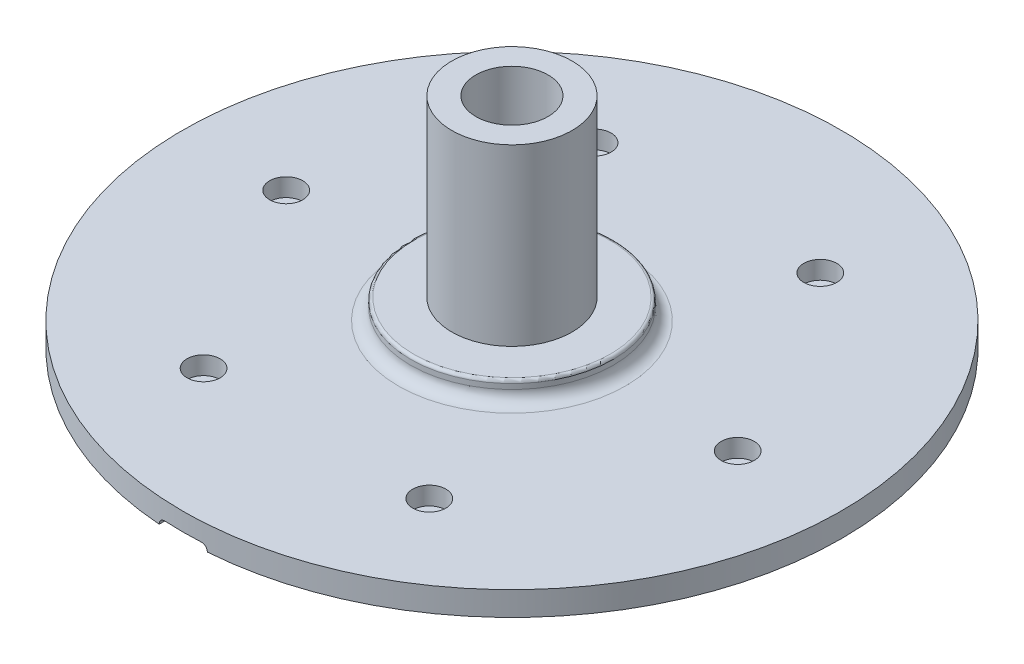
ISO-10303-21;
HEADER;
FILE_DESCRIPTION(('STEP AP214'),'2;1');
FILE_NAME('part.step','',(''),(''),'','','');
FILE_SCHEMA(('AUTOMOTIVE_DESIGN { 1 0 10303 214 1 1 1 1 }'));
ENDSEC;
DATA;
#1=APPLICATION_CONTEXT('core data for automotive mechanical design processes');
#2=APPLICATION_PROTOCOL_DEFINITION('international standard','automotive_design',2000,#1);
#3=PRODUCT_CONTEXT('',#1,'mechanical');
#4=PRODUCT('Part','Part','',(#3));
#5=PRODUCT_RELATED_PRODUCT_CATEGORY('part','',(#4));
#6=PRODUCT_DEFINITION_FORMATION('','',#4);
#7=PRODUCT_DEFINITION_CONTEXT('part definition',#1,'design');
#8=PRODUCT_DEFINITION('design','',#6,#7);
#9=PRODUCT_DEFINITION_SHAPE('','',#8);
#10=(LENGTH_UNIT() NAMED_UNIT(*) SI_UNIT(.MILLI.,.METRE.));
#11=(NAMED_UNIT(*) PLANE_ANGLE_UNIT() SI_UNIT($,.RADIAN.));
#12=(NAMED_UNIT(*) SI_UNIT($,.STERADIAN.) SOLID_ANGLE_UNIT());
#13=UNCERTAINTY_MEASURE_WITH_UNIT(LENGTH_MEASURE(1.E-05),#10,'distance_accuracy_value','');
#14=(GEOMETRIC_REPRESENTATION_CONTEXT(3) GLOBAL_UNCERTAINTY_ASSIGNED_CONTEXT((#13)) GLOBAL_UNIT_ASSIGNED_CONTEXT((#10,
#11,#12)) REPRESENTATION_CONTEXT('',''));
#15=CARTESIAN_POINT('',(0.,0.,0.));
#16=DIRECTION('',(0.,0.,1.));
#17=DIRECTION('',(1.,0.,0.));
#18=AXIS2_PLACEMENT_3D('',#15,#16,#17);
#19=CARTESIAN_POINT('',(0.,0.,0.));
#20=DIRECTION('',(0.,1.,0.));
#21=DIRECTION('',(0.,0.,1.));
#22=AXIS2_PLACEMENT_3D('',#19,#20,#21);
#23=PLANE('',#22);
#24=DIRECTION('',(0.,0.,-1.));
#25=VECTOR('',#24,1.);
#26=CARTESIAN_POINT('',(-4.,0.,54.6036857730318));
#27=LINE('',#26,#25);
#28=CARTESIAN_POINT('',(-3.99999248452974,5.79250762172273E-11,54.6037753877757));
#29=VERTEX_POINT('',#28);
#30=CARTESIAN_POINT('',(-4.,0.,49.8397431775085));
#31=VERTEX_POINT('',#30);
#32=EDGE_CURVE('E148',#29,#31,#27,.T.);
#33=ORIENTED_EDGE('',*,*,#32,.F.);
#34=CARTESIAN_POINT('',(0.,0.,0.));
#35=DIRECTION('',(0.,1.,0.));
#36=DIRECTION('',(0.,0.,1.));
#37=AXIS2_PLACEMENT_3D('',#34,#35,#36);
#38=CIRCLE('',#37,54.75);
#39=CARTESIAN_POINT('',(3.99999248546563,5.79245125022864E-11,54.6037753766161));
#40=VERTEX_POINT('',#39);
#41=EDGE_CURVE('E116',#40,#29,#38,.T.);
#42=ORIENTED_EDGE('',*,*,#41,.F.);
#43=DIRECTION('',(0.,0.,-1.));
#44=VECTOR('',#43,1.);
#45=CARTESIAN_POINT('',(4.,0.,54.6036857730318));
#46=LINE('',#45,#44);
#47=CARTESIAN_POINT('',(4.,0.,49.8397431775085));
#48=VERTEX_POINT('',#47);
#49=EDGE_CURVE('E105',#40,#48,#46,.T.);
#50=ORIENTED_EDGE('',*,*,#49,.T.);
#51=CARTESIAN_POINT('',(0.,0.,0.));
#52=DIRECTION('',(0.,-1.,0.));
#53=DIRECTION('',(0.,0.,-1.));
#54=AXIS2_PLACEMENT_3D('',#51,#52,#53);
#55=CIRCLE('',#54,50.);
#56=EDGE_CURVE('E113',#31,#48,#55,.T.);
#57=ORIENTED_EDGE('',*,*,#56,.F.);
#58=EDGE_LOOP('',(#33,#42,#50,#57));
#59=FACE_BOUND('',#58,.T.);
#60=ADVANCED_FACE('F58',(#59),#23,.F.);
#61=CARTESIAN_POINT('',(0.,4.,0.));
#62=DIRECTION('',(0.,-1.,0.));
#63=DIRECTION('',(0.,0.,-1.));
#64=AXIS2_PLACEMENT_3D('',#61,#62,#63);
#65=CYLINDRICAL_SURFACE('',#64,54.75);
#66=CARTESIAN_POINT('',(0.,4.,0.));
#67=DIRECTION('',(0.,1.,0.));
#68=DIRECTION('',(0.,0.,1.));
#69=AXIS2_PLACEMENT_3D('',#66,#67,#68);
#70=CIRCLE('',#69,54.75);
#71=CARTESIAN_POINT('',(0.,4.,54.75));
#72=VERTEX_POINT('',#71);
#73=EDGE_CURVE('E408',#72,#72,#70,.T.);
#74=ORIENTED_EDGE('',*,*,#73,.F.);
#75=EDGE_LOOP('',(#74));
#76=FACE_BOUND('',#75,.T.);
#77=ORIENTED_EDGE('',*,*,#41,.T.);
#78=CARTESIAN_POINT('',(-4.,0.,54.6036857730318));
#79=CARTESIAN_POINT('',(-3.99999985446044,0.0280840811662666,54.6036856585949));
#80=CARTESIAN_POINT('',(-3.99881618152549,0.0561546845115299,54.6037725078192));
#81=CARTESIAN_POINT('',(-3.99409430462446,0.112094517883442,54.6041181501451));
#82=CARTESIAN_POINT('',(-3.99055622893653,0.139963758797576,54.6043769338791));
#83=CARTESIAN_POINT('',(-3.97644532427771,0.222916400265359,54.6054070337225));
#84=CARTESIAN_POINT('',(-3.96237571667313,0.277443344649363,54.6064321128272));
#85=CARTESIAN_POINT('',(-3.92530785926014,0.383352177251849,54.6091091246826));
#86=CARTESIAN_POINT('',(-3.90230560677663,0.434732643582894,54.6107613384418));
#87=CARTESIAN_POINT('',(-3.84803382983652,0.532899444180286,54.6146122643966));
#88=CARTESIAN_POINT('',(-3.8167655443468,0.579686465502032,54.6168108946889));
#89=CARTESIAN_POINT('',(-3.74680556045204,0.667408321615945,54.6216548219943));
#90=CARTESIAN_POINT('',(-3.70810401110518,0.708335263275333,54.6243007111737));
#91=CARTESIAN_POINT('',(-3.62439381072865,0.783123604643407,54.6299187757258));
#92=CARTESIAN_POINT('',(-3.57938388017406,0.816983567484601,54.6328910172659));
#93=CARTESIAN_POINT('',(-3.48422056916623,0.876753602873496,54.6390426719798));
#94=CARTESIAN_POINT('',(-3.43405438107097,0.902643208610524,54.6422225935094));
#95=CARTESIAN_POINT('',(-3.33010080337111,0.945617286666318,54.648656278688));
#96=CARTESIAN_POINT('',(-3.27631549024449,0.962706760181071,54.6519099992961));
#97=CARTESIAN_POINT('',(-3.18517624341428,0.983412819601835,54.6572820389701));
#98=CARTESIAN_POINT('',(-3.1483925181046,0.989628859137046,54.6594135071652));
#99=CARTESIAN_POINT('',(-3.0744110201102,0.997922041076888,54.6636248520405));
#100=CARTESIAN_POINT('',(-3.0372138998526,1.00000497105214,54.6657047968298));
#101=CARTESIAN_POINT('',(-2.99999794403964,0.999999999997886,54.6677465452506));
#102=B_SPLINE_CURVE_WITH_KNOTS('',3,(#78,#79,#80,#81,#82,#83,#84,#85,#86,#87,#88,#89,#90,#91,
#92,#93,#94,#95,#96,#97,#98,#99,#100,#101),.UNSPECIFIED.,.F.,.F.,(4,2,2,2,2,2,2,2,2,2,2,4),(0.,
0.0842004147793472,0.168396242327258,0.336495793541652,0.504670756432097,0.672820526441465,
0.841194694212357,1.00960306276371,1.17844034220572,1.34718156368037,1.45906347285167,
1.57078860352853),.UNSPECIFIED.);
#103=CARTESIAN_POINT('',(-2.99999897322293,1.,54.6677652776507));
#104=VERTEX_POINT('',#103);
#105=EDGE_CURVE('E108',#29,#104,#102,.T.);
#106=ORIENTED_EDGE('',*,*,#105,.T.);
#107=CARTESIAN_POINT('',(4.,1.,54.6036857730318));
#108=CARTESIAN_POINT('',(0.,1.,54.8967062857223));
#109=CARTESIAN_POINT('',(-4.,1.,54.6036857730318));
#110=B_SPLINE_CURVE_WITH_KNOTS('',2,(#107,#108,#109),.UNSPECIFIED.,.F.,.F.,(3,3),(0.,1.),.UNSPECIFIED.);
#111=CARTESIAN_POINT('',(2.99999897322292,1.,54.6677652776507));
#112=VERTEX_POINT('',#111);
#113=EDGE_CURVE('E138',#112,#104,#110,.T.);
#114=ORIENTED_EDGE('',*,*,#113,.F.);
#115=CARTESIAN_POINT('',(2.99999794403964,0.999999999997886,54.6677465452506));
#116=CARTESIAN_POINT('',(3.02817927701189,0.999999850739543,54.6662001627348));
#117=CARTESIAN_POINT('',(3.05634586174402,0.998808092967797,54.664632459917));
#118=CARTESIAN_POINT('',(3.11247501895082,0.994054047311631,54.6614652887089));
#119=CARTESIAN_POINT('',(3.14043760150178,0.990491877321499,54.6598658219023));
#120=CARTESIAN_POINT('',(3.22367144796423,0.976284023957289,54.6550410898513));
#121=CARTESIAN_POINT('',(3.27838161866219,0.96211690206642,54.6517843916984));
#122=CARTESIAN_POINT('',(3.38464108984771,0.924785557755884,54.645306733339));
#123=CARTESIAN_POINT('',(3.43618888487599,0.901617088113716,54.6420857907426));
#124=CARTESIAN_POINT('',(3.53466092682612,0.84693964356853,54.6358042553257));
#125=CARTESIAN_POINT('',(3.58158598884849,0.81543214266497,54.6327436342813));
#126=CARTESIAN_POINT('',(3.66946851540552,0.744972493054208,54.6269113559045));
#127=CARTESIAN_POINT('',(3.71042728902181,0.706021981789856,54.6241396352215));
#128=CARTESIAN_POINT('',(3.78522978009254,0.621761860342437,54.6190071754784));
#129=CARTESIAN_POINT('',(3.81907214858759,0.576451047233625,54.6166465143517));
#130=CARTESIAN_POINT('',(3.87861204286243,0.480841906149723,54.6124506076156));
#131=CARTESIAN_POINT('',(3.90432197397186,0.430551329766027,54.610614562168));
#132=CARTESIAN_POINT('',(3.94691692874584,0.326359847466648,54.6075526434022));
#133=CARTESIAN_POINT('',(3.96380742758007,0.272461204971755,54.606326391542));
#134=CARTESIAN_POINT('',(3.98400791924151,0.181850525979485,54.6048554998146));
#135=CARTESIAN_POINT('',(3.99000126404608,0.145717165536566,54.6044175634401));
#136=CARTESIAN_POINT('',(3.99799674901361,0.0730610285465408,54.6038325271444));
#137=CARTESIAN_POINT('',(4.00000451700256,0.0365388744143386,54.6036850171298));
#138=CARTESIAN_POINT('',(4.,0.,54.6036857730318));
#139=B_SPLINE_CURVE_WITH_KNOTS('',3,(#115,#116,#117,#118,#119,#120,#121,#122,#123,#124,#125,
#126,#127,#128,#129,#130,#131,#132,#133,#134,#135,#136,#137,#138),.UNSPECIFIED.,.F.,.F.,(4,2,2,
2,2,2,2,2,2,2,2,4),(0.,0.0846191084571793,0.169234008631973,0.338188513694618,0.507222835757362,
0.676227299400799,0.845194625219855,1.01419395104434,1.18293422573711,1.35156962028003,
1.46125326629247,1.57078192324304),.UNSPECIFIED.);
#140=EDGE_CURVE('E12',#112,#40,#139,.T.);
#141=ORIENTED_EDGE('',*,*,#140,.T.);
#142=EDGE_LOOP('',(#77,#106,#114,#141));
#143=FACE_BOUND('',#142,.T.);
#144=ADVANCED_FACE('F173',(#76,#143),#65,.T.);
#145=CARTESIAN_POINT('',(0.,0.,0.));
#146=DIRECTION('',(0.,-1.,0.));
#147=DIRECTION('',(0.,0.,-1.));
#148=AXIS2_PLACEMENT_3D('',#145,#146,#147);
#149=TOROIDAL_SURFACE('',#148,49.,1.);
#150=CARTESIAN_POINT('',(0.,1.,0.));
#151=DIRECTION('',(0.,-1.,0.));
#152=DIRECTION('',(0.,0.,-1.));
#153=AXIS2_PLACEMENT_3D('',#150,#151,#152);
#154=CIRCLE('',#153,49.);
#155=CARTESIAN_POINT('',(-3.,1.,48.9080770425499));
#156=VERTEX_POINT('',#155);
#157=CARTESIAN_POINT('',(3.,1.,48.9080770425499));
#158=VERTEX_POINT('',#157);
#159=EDGE_CURVE('E80',#156,#158,#154,.T.);
#160=ORIENTED_EDGE('',*,*,#159,.F.);
#161=CARTESIAN_POINT('',(-4.,0.,49.8397431775085));
#162=CARTESIAN_POINT('',(-4.00000278585227,0.0229222206234719,49.839745695781));
#163=CARTESIAN_POINT('',(-3.99921117989386,0.0458308105526433,49.839015134099));
#164=CARTESIAN_POINT('',(-3.99607281705364,0.0914345264381979,49.8361184521695));
#165=CARTESIAN_POINT('',(-3.9937271206357,0.114129787261107,49.8339533108352));
#166=CARTESIAN_POINT('',(-3.98446099866839,0.181276874253113,49.8253996036851));
#167=CARTESIAN_POINT('',(-3.97531022842063,0.22518936338448,49.816951557909));
#168=CARTESIAN_POINT('',(-3.95172194289012,0.310111479105864,49.7951657749428));
#169=CARTESIAN_POINT('',(-3.93729681313003,0.351127639944159,49.7818394929937));
#170=CARTESIAN_POINT('',(-3.9039806969301,0.429703423598822,49.751044831252));
#171=CARTESIAN_POINT('',(-3.88508073418288,0.46725588522724,49.7335681256853));
#172=CARTESIAN_POINT('',(-3.83602856102479,0.551573508768524,49.6881807898131));
#173=CARTESIAN_POINT('',(-3.80429738584548,0.596627195729321,49.6587993915992));
#174=CARTESIAN_POINT('',(-3.73595406125653,0.679157078939375,49.5954512292046));
#175=CARTESIAN_POINT('',(-3.69933327751272,0.716619568649355,49.5614763522431));
#176=CARTESIAN_POINT('',(-3.60955641056058,0.795700610099045,49.4780907142936));
#177=CARTESIAN_POINT('',(-3.5550243662645,0.834369382194132,49.4273708671904));
#178=CARTESIAN_POINT('',(-3.44224414962143,0.899255583240296,49.3222995473942));
#179=CARTESIAN_POINT('',(-3.38399216091942,0.925459984223149,49.2679443423299));
#180=CARTESIAN_POINT('',(-3.27233547493399,0.96379563546287,49.1635766479788));
#181=CARTESIAN_POINT('',(-3.21914805190754,0.977202798931372,49.1137877255146));
#182=CARTESIAN_POINT('',(-3.11214923851623,0.995166874072868,49.0134699629707));
#183=CARTESIAN_POINT('',(-3.05833933484674,0.999741705529843,48.9629428310653));
#184=CARTESIAN_POINT('',(-3.00307421459362,0.999996453180307,48.9109684004463));
#185=CARTESIAN_POINT('',(-3.00153706850272,0.999999996856626,48.9095227172694));
#186=CARTESIAN_POINT('',(-3.,1.,48.9080770425499));
#187=B_SPLINE_CURVE_WITH_KNOTS('',3,(#161,#162,#163,#164,#165,#166,#167,#168,#169,#170,#171,
#172,#173,#174,#175,#176,#177,#178,#179,#180,#181,#182,#183,#184,#185,#186),.UNSPECIFIED.,.F.,
.F.,(4,2,2,2,2,2,2,2,2,2,2,2,4),(0.,0.0687154413472005,0.137384041603443,0.273541438552999,
0.409381135845547,0.545495665033754,0.731820123298019,0.918478065610742,1.16888069672829,
1.41954448083694,1.64125542382818,1.86251606618218,1.86884657115884),.UNSPECIFIED.);
#188=EDGE_CURVE('E119',#156,#31,#187,.F.);
#189=ORIENTED_EDGE('',*,*,#188,.T.);
#190=ORIENTED_EDGE('',*,*,#56,.T.);
#191=CARTESIAN_POINT('',(4.,0.,49.8397431775085));
#192=CARTESIAN_POINT('',(4.00000278585227,0.0229222206234719,49.839745695781));
#193=CARTESIAN_POINT('',(3.99921117989386,0.0458308105526433,49.839015134099));
#194=CARTESIAN_POINT('',(3.99607281705364,0.0914345264381979,49.8361184521695));
#195=CARTESIAN_POINT('',(3.9937271206357,0.114129787261107,49.8339533108352));
#196=CARTESIAN_POINT('',(3.98446099866839,0.181276874253113,49.8253996036851));
#197=CARTESIAN_POINT('',(3.97531022842063,0.22518936338448,49.816951557909));
#198=CARTESIAN_POINT('',(3.95172194289012,0.310111479105864,49.7951657749428));
#199=CARTESIAN_POINT('',(3.93729681313003,0.351127639944159,49.7818394929937));
#200=CARTESIAN_POINT('',(3.9039806969301,0.429703423598822,49.751044831252));
#201=CARTESIAN_POINT('',(3.88508073418288,0.46725588522724,49.7335681256853));
#202=CARTESIAN_POINT('',(3.83602856102479,0.551573508768524,49.6881807898131));
#203=CARTESIAN_POINT('',(3.80429738584548,0.596627195729321,49.6587993915992));
#204=CARTESIAN_POINT('',(3.73595406125653,0.679157078939375,49.5954512292046));
#205=CARTESIAN_POINT('',(3.69933327751272,0.716619568649355,49.5614763522431));
#206=CARTESIAN_POINT('',(3.60955641056058,0.795700610099045,49.4780907142936));
#207=CARTESIAN_POINT('',(3.5550243662645,0.834369382194132,49.4273708671904));
#208=CARTESIAN_POINT('',(3.44224414962143,0.899255583240296,49.3222995473942));
#209=CARTESIAN_POINT('',(3.38399216091942,0.925459984223149,49.2679443423299));
#210=CARTESIAN_POINT('',(3.27233547493399,0.96379563546287,49.1635766479788));
#211=CARTESIAN_POINT('',(3.21914805190754,0.977202798931372,49.1137877255146));
#212=CARTESIAN_POINT('',(3.11214923851623,0.995166874072868,49.0134699629707));
#213=CARTESIAN_POINT('',(3.05833933484674,0.999741705529843,48.9629428310653));
#214=CARTESIAN_POINT('',(3.00307421459362,0.999996453180307,48.9109684004463));
#215=CARTESIAN_POINT('',(3.00153706850272,0.999999996856626,48.9095227172694));
#216=CARTESIAN_POINT('',(3.,1.,48.9080770425499));
#217=B_SPLINE_CURVE_WITH_KNOTS('',3,(#191,#192,#193,#194,#195,#196,#197,#198,#199,#200,#201,
#202,#203,#204,#205,#206,#207,#208,#209,#210,#211,#212,#213,#214,#215,#216),.UNSPECIFIED.,.F.,
.F.,(4,2,2,2,2,2,2,2,2,2,2,2,4),(0.,0.0687154413472005,0.137384041603443,0.273541438552999,
0.409381135845547,0.545495665033754,0.731820123298019,0.918478065610742,1.16888069672829,
1.41954448083694,1.64125542382818,1.86251606618218,1.86884657115884),.UNSPECIFIED.);
#218=EDGE_CURVE('E73',#48,#158,#217,.T.);
#219=ORIENTED_EDGE('',*,*,#218,.T.);
#220=EDGE_LOOP('',(#160,#189,#190,#219));
#221=FACE_BOUND('',#220,.T.);
#222=ADVANCED_FACE('F118',(#221),#149,.F.);
#223=CARTESIAN_POINT('',(0.,0.,0.));
#224=DIRECTION('',(0.,1.,0.));
#225=DIRECTION('',(0.,0.,1.));
#226=AXIS2_PLACEMENT_3D('',#223,#224,#225);
#227=CIRCLE('',#226,6.);
#228=CARTESIAN_POINT('',(0.,0.,6.));
#229=VERTEX_POINT('',#228);
#230=EDGE_CURVE('E120',#229,#229,#227,.T.);
#231=ORIENTED_EDGE('',*,*,#230,.T.);
#232=EDGE_LOOP('',(#231));
#233=FACE_BOUND('',#232,.T.);
#234=CARTESIAN_POINT('',(0.,0.,0.));
#235=DIRECTION('',(0.,-1.,0.));
#236=DIRECTION('',(0.,0.,-1.));
#237=AXIS2_PLACEMENT_3D('',#234,#235,#236);
#238=CIRCLE('',#237,22.5);
#239=CARTESIAN_POINT('',(0.,0.,-22.5));
#240=VERTEX_POINT('',#239);
#241=EDGE_CURVE('E123',#240,#240,#238,.T.);
#242=ORIENTED_EDGE('',*,*,#241,.T.);
#243=EDGE_LOOP('',(#242));
#244=FACE_BOUND('',#243,.T.);
#245=ADVANCED_FACE('F210',(#233,#244),#23,.F.);
#246=CARTESIAN_POINT('',(0.,0.,0.));
#247=DIRECTION('',(0.,-1.,0.));
#248=DIRECTION('',(0.,0.,-1.));
#249=AXIS2_PLACEMENT_3D('',#246,#247,#248);
#250=CIRCLE('',#249,30.);
#251=CARTESIAN_POINT('',(0.,0.,-30.));
#252=VERTEX_POINT('',#251);
#253=EDGE_CURVE('E135',#252,#252,#250,.T.);
#254=ORIENTED_EDGE('',*,*,#253,.F.);
#255=EDGE_LOOP('',(#254));
#256=FACE_BOUND('',#255,.T.);
#257=CARTESIAN_POINT('',(-18.7500000000004,0.,-32.4759526419162));
#258=DIRECTION('',(0.,1.,0.));
#259=DIRECTION('',(-0.866025403784433,0.,0.50000000000001));
#260=AXIS2_PLACEMENT_3D('',#257,#258,#259);
#261=CIRCLE('',#260,1.5);
#262=CARTESIAN_POINT('',(-20.049038105677,0.,-31.7259526419162));
#263=VERTEX_POINT('',#262);
#264=EDGE_CURVE('E142',#263,#263,#261,.T.);
#265=ORIENTED_EDGE('',*,*,#264,.T.);
#266=EDGE_LOOP('',(#265));
#267=FACE_BOUND('',#266,.T.);
#268=CARTESIAN_POINT('',(18.7499999999997,0.,-32.4759526419166));
#269=DIRECTION('',(0.,1.,0.));
#270=DIRECTION('',(-0.866025403784443,0.,-0.499999999999992));
#271=AXIS2_PLACEMENT_3D('',#268,#269,#270);
#272=CIRCLE('',#271,1.5);
#273=CARTESIAN_POINT('',(17.450961894323,0.,-33.2259526419166));
#274=VERTEX_POINT('',#273);
#275=EDGE_CURVE('E392',#274,#274,#272,.T.);
#276=ORIENTED_EDGE('',*,*,#275,.T.);
#277=EDGE_LOOP('',(#276));
#278=FACE_BOUND('',#277,.T.);
#279=CARTESIAN_POINT('',(37.5,0.,0.));
#280=DIRECTION('',(0.,1.,0.));
#281=DIRECTION('',(0.,0.,-1.));
#282=AXIS2_PLACEMENT_3D('',#279,#280,#281);
#283=CIRCLE('',#282,1.5);
#284=CARTESIAN_POINT('',(37.5,0.,-1.5));
#285=VERTEX_POINT('',#284);
#286=EDGE_CURVE('E389',#285,#285,#283,.T.);
#287=ORIENTED_EDGE('',*,*,#286,.T.);
#288=EDGE_LOOP('',(#287));
#289=FACE_BOUND('',#288,.T.);
#290=CARTESIAN_POINT('',(18.7500000000002,0.,32.4759526419164));
#291=DIRECTION('',(0.,1.,0.));
#292=DIRECTION('',(0.866025403784436,0.,-0.500000000000004));
#293=AXIS2_PLACEMENT_3D('',#290,#291,#292);
#294=CIRCLE('',#293,1.5);
#295=CARTESIAN_POINT('',(20.0490381056768,0.,31.7259526419164));
#296=VERTEX_POINT('',#295);
#297=EDGE_CURVE('E385',#296,#296,#294,.T.);
#298=ORIENTED_EDGE('',*,*,#297,.T.);
#299=EDGE_LOOP('',(#298));
#300=FACE_BOUND('',#299,.T.);
#301=CARTESIAN_POINT('',(-18.7499999999999,0.,32.4759526419165));
#302=DIRECTION('',(0.,1.,0.));
#303=DIRECTION('',(0.86602540378444,0.,0.499999999999998));
#304=AXIS2_PLACEMENT_3D('',#301,#302,#303);
#305=CIRCLE('',#304,1.5);
#306=CARTESIAN_POINT('',(-17.4509618943233,0.,33.2259526419165));
#307=VERTEX_POINT('',#306);
#308=EDGE_CURVE('E388',#307,#307,#305,.T.);
#309=ORIENTED_EDGE('',*,*,#308,.T.);
#310=EDGE_LOOP('',(#309));
#311=FACE_BOUND('',#310,.T.);
#312=CARTESIAN_POINT('',(-37.5,0.,0.));
#313=DIRECTION('',(0.,1.,0.));
#314=DIRECTION('',(0.,0.,1.));
#315=AXIS2_PLACEMENT_3D('',#312,#313,#314);
#316=CIRCLE('',#315,1.5);
#317=CARTESIAN_POINT('',(-37.5,0.,1.5));
#318=VERTEX_POINT('',#317);
#319=EDGE_CURVE('E134',#318,#318,#316,.T.);
#320=ORIENTED_EDGE('',*,*,#319,.T.);
#321=EDGE_LOOP('',(#320));
#322=FACE_BOUND('',#321,.T.);
#323=CARTESIAN_POINT('',(0.,0.,0.));
#324=DIRECTION('',(0.,-1.,0.));
#325=DIRECTION('',(0.,0.,-1.));
#326=AXIS2_PLACEMENT_3D('',#323,#324,#325);
#327=CIRCLE('',#326,45.);
#328=CARTESIAN_POINT('',(0.,0.,-45.));
#329=VERTEX_POINT('',#328);
#330=EDGE_CURVE('E130',#329,#329,#327,.T.);
#331=ORIENTED_EDGE('',*,*,#330,.T.);
#332=EDGE_LOOP('',(#331));
#333=FACE_BOUND('',#332,.T.);
#334=ADVANCED_FACE('F244',(#256,#267,#278,#289,#300,#311,#322,#333),#23,.F.);
#335=CARTESIAN_POINT('',(0.,7.35,0.));
#336=DIRECTION('',(0.,1.,0.));
#337=DIRECTION('',(0.,0.,1.));
#338=AXIS2_PLACEMENT_3D('',#335,#336,#337);
#339=PLANE('',#338);
#340=CARTESIAN_POINT('',(0.,7.35,0.));
#341=DIRECTION('',(0.,1.,0.));
#342=DIRECTION('',(0.,0.,1.));
#343=AXIS2_PLACEMENT_3D('',#340,#341,#342);
#344=CIRCLE('',#343,16.35);
#345=CARTESIAN_POINT('',(0.,7.35,16.35));
#346=VERTEX_POINT('',#345);
#347=EDGE_CURVE('E133',#346,#346,#344,.T.);
#348=ORIENTED_EDGE('',*,*,#347,.T.);
#349=EDGE_LOOP('',(#348));
#350=FACE_BOUND('',#349,.T.);
#351=CARTESIAN_POINT('',(0.,7.35,0.));
#352=DIRECTION('',(0.,1.,0.));
#353=DIRECTION('',(0.,0.,1.));
#354=AXIS2_PLACEMENT_3D('',#351,#352,#353);
#355=CIRCLE('',#354,10.);
#356=CARTESIAN_POINT('',(0.,7.35,-10.));
#357=VERTEX_POINT('',#356);
#358=EDGE_CURVE('E342',#357,#357,#355,.T.);
#359=ORIENTED_EDGE('',*,*,#358,.F.);
#360=EDGE_LOOP('',(#359));
#361=FACE_BOUND('',#360,.T.);
#362=ADVANCED_FACE('F257',(#350,#361),#339,.T.);
#363=CARTESIAN_POINT('',(-18.7499999999999,0.,32.4759526419165));
#364=DIRECTION('',(0.,1.,0.));
#365=DIRECTION('',(0.,0.,1.));
#366=AXIS2_PLACEMENT_3D('',#363,#364,#365);
#367=CYLINDRICAL_SURFACE('',#366,1.5);
#368=ORIENTED_EDGE('',*,*,#308,.F.);
#369=EDGE_LOOP('',(#368));
#370=FACE_BOUND('',#369,.T.);
#371=CARTESIAN_POINT('',(-18.7499999999999,1.,32.4759526419165));
#372=DIRECTION('',(0.,1.,0.));
#373=DIRECTION('',(0.,0.,1.));
#374=AXIS2_PLACEMENT_3D('',#371,#372,#373);
#375=CIRCLE('',#374,1.5);
#376=CARTESIAN_POINT('',(-18.7499999999999,1.,33.9759526419165));
#377=VERTEX_POINT('',#376);
#378=EDGE_CURVE('E382',#377,#377,#375,.F.);
#379=ORIENTED_EDGE('',*,*,#378,.F.);
#380=EDGE_LOOP('',(#379));
#381=FACE_BOUND('',#380,.T.);
#382=ADVANCED_FACE('F260',(#370,#381),#367,.F.);
#383=CARTESIAN_POINT('',(18.7500000000002,0.,32.4759526419164));
#384=DIRECTION('',(0.,1.,0.));
#385=DIRECTION('',(0.,0.,1.));
#386=AXIS2_PLACEMENT_3D('',#383,#384,#385);
#387=CYLINDRICAL_SURFACE('',#386,1.5);
#388=ORIENTED_EDGE('',*,*,#297,.F.);
#389=EDGE_LOOP('',(#388));
#390=FACE_BOUND('',#389,.T.);
#391=CARTESIAN_POINT('',(18.7500000000002,1.,32.4759526419164));
#392=DIRECTION('',(0.,1.,0.));
#393=DIRECTION('',(0.,0.,1.));
#394=AXIS2_PLACEMENT_3D('',#391,#392,#393);
#395=CIRCLE('',#394,1.5);
#396=CARTESIAN_POINT('',(18.7500000000002,1.,33.9759526419164));
#397=VERTEX_POINT('',#396);
#398=EDGE_CURVE('E353',#397,#397,#395,.F.);
#399=ORIENTED_EDGE('',*,*,#398,.F.);
#400=EDGE_LOOP('',(#399));
#401=FACE_BOUND('',#400,.T.);
#402=ADVANCED_FACE('F276',(#390,#401),#387,.F.);
#403=CARTESIAN_POINT('',(37.5,0.,0.));
#404=DIRECTION('',(0.,1.,0.));
#405=DIRECTION('',(0.,0.,1.));
#406=AXIS2_PLACEMENT_3D('',#403,#404,#405);
#407=CYLINDRICAL_SURFACE('',#406,1.5);
#408=ORIENTED_EDGE('',*,*,#286,.F.);
#409=EDGE_LOOP('',(#408));
#410=FACE_BOUND('',#409,.T.);
#411=CARTESIAN_POINT('',(37.5,1.,0.));
#412=DIRECTION('',(0.,1.,0.));
#413=DIRECTION('',(0.,0.,1.));
#414=AXIS2_PLACEMENT_3D('',#411,#412,#413);
#415=CIRCLE('',#414,1.5);
#416=CARTESIAN_POINT('',(37.5,1.,1.5));
#417=VERTEX_POINT('',#416);
#418=EDGE_CURVE('E362',#417,#417,#415,.F.);
#419=ORIENTED_EDGE('',*,*,#418,.F.);
#420=EDGE_LOOP('',(#419));
#421=FACE_BOUND('',#420,.T.);
#422=ADVANCED_FACE('F284',(#410,#421),#407,.F.);
#423=CARTESIAN_POINT('',(18.7499999999997,0.,-32.4759526419166));
#424=DIRECTION('',(0.,1.,0.));
#425=DIRECTION('',(0.,0.,1.));
#426=AXIS2_PLACEMENT_3D('',#423,#424,#425);
#427=CYLINDRICAL_SURFACE('',#426,1.5);
#428=ORIENTED_EDGE('',*,*,#275,.F.);
#429=EDGE_LOOP('',(#428));
#430=FACE_BOUND('',#429,.T.);
#431=CARTESIAN_POINT('',(18.7499999999997,1.,-32.4759526419166));
#432=DIRECTION('',(0.,1.,0.));
#433=DIRECTION('',(0.,0.,1.));
#434=AXIS2_PLACEMENT_3D('',#431,#432,#433);
#435=CIRCLE('',#434,1.5);
#436=CARTESIAN_POINT('',(18.7499999999997,1.,-30.9759526419166));
#437=VERTEX_POINT('',#436);
#438=EDGE_CURVE('E369',#437,#437,#435,.F.);
#439=ORIENTED_EDGE('',*,*,#438,.F.);
#440=EDGE_LOOP('',(#439));
#441=FACE_BOUND('',#440,.T.);
#442=ADVANCED_FACE('F280',(#430,#441),#427,.F.);
#443=CARTESIAN_POINT('',(-18.7500000000004,0.,-32.4759526419162));
#444=DIRECTION('',(0.,1.,0.));
#445=DIRECTION('',(0.,0.,1.));
#446=AXIS2_PLACEMENT_3D('',#443,#444,#445);
#447=CYLINDRICAL_SURFACE('',#446,1.5);
#448=ORIENTED_EDGE('',*,*,#264,.F.);
#449=EDGE_LOOP('',(#448));
#450=FACE_BOUND('',#449,.T.);
#451=CARTESIAN_POINT('',(-18.7500000000004,1.,-32.4759526419162));
#452=DIRECTION('',(0.,1.,0.));
#453=DIRECTION('',(0.,0.,1.));
#454=AXIS2_PLACEMENT_3D('',#451,#452,#453);
#455=CIRCLE('',#454,1.5);
#456=CARTESIAN_POINT('',(-18.7500000000004,1.,-30.9759526419162));
#457=VERTEX_POINT('',#456);
#458=EDGE_CURVE('E376',#457,#457,#455,.F.);
#459=ORIENTED_EDGE('',*,*,#458,.F.);
#460=EDGE_LOOP('',(#459));
#461=FACE_BOUND('',#460,.T.);
#462=ADVANCED_FACE('F264',(#450,#461),#447,.F.);
#463=CARTESIAN_POINT('',(-37.5,0.,0.));
#464=DIRECTION('',(0.,1.,0.));
#465=DIRECTION('',(0.,0.,1.));
#466=AXIS2_PLACEMENT_3D('',#463,#464,#465);
#467=CYLINDRICAL_SURFACE('',#466,1.5);
#468=ORIENTED_EDGE('',*,*,#319,.F.);
#469=EDGE_LOOP('',(#468));
#470=FACE_BOUND('',#469,.T.);
#471=CARTESIAN_POINT('',(-37.5,1.,0.));
#472=DIRECTION('',(0.,1.,0.));
#473=DIRECTION('',(0.,0.,1.));
#474=AXIS2_PLACEMENT_3D('',#471,#472,#473);
#475=CIRCLE('',#474,1.5);
#476=CARTESIAN_POINT('',(-37.5,1.,1.5));
#477=VERTEX_POINT('',#476);
#478=EDGE_CURVE('E402',#477,#477,#475,.F.);
#479=ORIENTED_EDGE('',*,*,#478,.F.);
#480=EDGE_LOOP('',(#479));
#481=FACE_BOUND('',#480,.T.);
#482=ADVANCED_FACE('F249',(#470,#481),#467,.F.);
#483=CARTESIAN_POINT('',(0.,4.,0.));
#484=DIRECTION('',(0.,1.,0.));
#485=DIRECTION('',(0.,0.,1.));
#486=AXIS2_PLACEMENT_3D('',#483,#484,#485);
#487=PLANE('',#486);
#488=CARTESIAN_POINT('',(-18.7500000000004,4.,-32.4759526419162));
#489=DIRECTION('',(0.,1.,0.));
#490=DIRECTION('',(-0.866025403784433,0.,0.50000000000001));
#491=AXIS2_PLACEMENT_3D('',#488,#489,#490);
#492=CIRCLE('',#491,2.75);
#493=CARTESIAN_POINT('',(-21.1315698604076,4.,-31.1009526419162));
#494=VERTEX_POINT('',#493);
#495=EDGE_CURVE('E370',#494,#494,#492,.T.);
#496=ORIENTED_EDGE('',*,*,#495,.F.);
#497=EDGE_LOOP('',(#496));
#498=FACE_BOUND('',#497,.T.);
#499=CARTESIAN_POINT('',(18.7499999999997,4.,-32.4759526419166));
#500=DIRECTION('',(0.,1.,0.));
#501=DIRECTION('',(-0.866025403784443,0.,-0.499999999999992));
#502=AXIS2_PLACEMENT_3D('',#499,#500,#501);
#503=CIRCLE('',#502,2.75);
#504=CARTESIAN_POINT('',(16.3684301395925,4.,-33.8509526419166));
#505=VERTEX_POINT('',#504);
#506=EDGE_CURVE('E363',#505,#505,#503,.T.);
#507=ORIENTED_EDGE('',*,*,#506,.F.);
#508=EDGE_LOOP('',(#507));
#509=FACE_BOUND('',#508,.T.);
#510=CARTESIAN_POINT('',(37.5,4.,0.));
#511=DIRECTION('',(0.,1.,0.));
#512=DIRECTION('',(0.,0.,-1.));
#513=AXIS2_PLACEMENT_3D('',#510,#511,#512);
#514=CIRCLE('',#513,2.75);
#515=CARTESIAN_POINT('',(37.5,4.,-2.75));
#516=VERTEX_POINT('',#515);
#517=EDGE_CURVE('E354',#516,#516,#514,.T.);
#518=ORIENTED_EDGE('',*,*,#517,.F.);
#519=EDGE_LOOP('',(#518));
#520=FACE_BOUND('',#519,.T.);
#521=CARTESIAN_POINT('',(18.7500000000002,4.,32.4759526419164));
#522=DIRECTION('',(0.,1.,0.));
#523=DIRECTION('',(0.866025403784436,0.,-0.500000000000004));
#524=AXIS2_PLACEMENT_3D('',#521,#522,#523);
#525=CIRCLE('',#524,2.75);
#526=CARTESIAN_POINT('',(21.1315698604074,4.,31.1009526419164));
#527=VERTEX_POINT('',#526);
#528=EDGE_CURVE('E355',#527,#527,#525,.T.);
#529=ORIENTED_EDGE('',*,*,#528,.F.);
#530=EDGE_LOOP('',(#529));
#531=FACE_BOUND('',#530,.T.);
#532=CARTESIAN_POINT('',(-18.7499999999999,4.,32.4759526419165));
#533=DIRECTION('',(0.,1.,0.));
#534=DIRECTION('',(0.86602540378444,0.,0.499999999999998));
#535=AXIS2_PLACEMENT_3D('',#532,#533,#534);
#536=CIRCLE('',#535,2.75);
#537=CARTESIAN_POINT('',(-16.3684301395927,4.,33.8509526419165));
#538=VERTEX_POINT('',#537);
#539=EDGE_CURVE('E348',#538,#538,#536,.T.);
#540=ORIENTED_EDGE('',*,*,#539,.F.);
#541=EDGE_LOOP('',(#540));
#542=FACE_BOUND('',#541,.T.);
#543=CARTESIAN_POINT('',(-37.5,4.,0.));
#544=DIRECTION('',(0.,1.,0.));
#545=DIRECTION('',(0.,0.,1.));
#546=AXIS2_PLACEMENT_3D('',#543,#544,#545);
#547=CIRCLE('',#546,2.75);
#548=CARTESIAN_POINT('',(-37.5,4.,2.75));
#549=VERTEX_POINT('',#548);
#550=EDGE_CURVE('E377',#549,#549,#547,.T.);
#551=ORIENTED_EDGE('',*,*,#550,.F.);
#552=EDGE_LOOP('',(#551));
#553=FACE_BOUND('',#552,.T.);
#554=CARTESIAN_POINT('',(0.,4.,0.));
#555=DIRECTION('',(0.,1.,0.));
#556=DIRECTION('',(0.,0.,1.));
#557=AXIS2_PLACEMENT_3D('',#554,#555,#556);
#558=CIRCLE('',#557,18.85);
#559=CARTESIAN_POINT('',(0.,4.,18.85));
#560=VERTEX_POINT('',#559);
#561=EDGE_CURVE('E411',#560,#560,#558,.F.);
#562=ORIENTED_EDGE('',*,*,#561,.T.);
#563=EDGE_LOOP('',(#562));
#564=FACE_BOUND('',#563,.T.);
#565=ORIENTED_EDGE('',*,*,#73,.T.);
#566=EDGE_LOOP('',(#565));
#567=FACE_BOUND('',#566,.T.);
#568=ADVANCED_FACE('F245',(#498,#509,#520,#531,#542,#553,#564,#567),#487,.T.);
#569=CARTESIAN_POINT('',(0.,4.,0.));
#570=DIRECTION('',(0.,-1.,0.));
#571=DIRECTION('',(0.,0.,-1.));
#572=AXIS2_PLACEMENT_3D('',#569,#570,#571);
#573=CYLINDRICAL_SURFACE('',#572,6.);
#574=ORIENTED_EDGE('',*,*,#230,.F.);
#575=EDGE_LOOP('',(#574));
#576=FACE_BOUND('',#575,.T.);
#577=CARTESIAN_POINT('',(0.,36.35,0.));
#578=DIRECTION('',(0.,1.,0.));
#579=DIRECTION('',(0.,0.,1.));
#580=AXIS2_PLACEMENT_3D('',#577,#578,#579);
#581=CIRCLE('',#580,6.);
#582=CARTESIAN_POINT('',(0.,36.35,6.));
#583=VERTEX_POINT('',#582);
#584=EDGE_CURVE('E128',#583,#583,#581,.T.);
#585=ORIENTED_EDGE('',*,*,#584,.T.);
#586=EDGE_LOOP('',(#585));
#587=FACE_BOUND('',#586,.T.);
#588=ADVANCED_FACE('F248',(#576,#587),#573,.F.);
#589=CARTESIAN_POINT('',(0.,7.35,0.));
#590=DIRECTION('',(0.,-1.,0.));
#591=DIRECTION('',(0.,0.,-1.));
#592=AXIS2_PLACEMENT_3D('',#589,#590,#591);
#593=CYLINDRICAL_SURFACE('',#592,16.85);
#594=CARTESIAN_POINT('',(0.,6.85,0.));
#595=DIRECTION('',(0.,1.,0.));
#596=DIRECTION('',(0.,0.,1.));
#597=AXIS2_PLACEMENT_3D('',#594,#595,#596);
#598=CIRCLE('',#597,16.85);
#599=CARTESIAN_POINT('',(0.,6.85,16.85));
#600=VERTEX_POINT('',#599);
#601=EDGE_CURVE('E416',#600,#600,#598,.F.);
#602=ORIENTED_EDGE('',*,*,#601,.T.);
#603=EDGE_LOOP('',(#602));
#604=FACE_BOUND('',#603,.T.);
#605=CARTESIAN_POINT('',(0.,6.,0.));
#606=DIRECTION('',(0.,1.,0.));
#607=DIRECTION('',(0.,0.,1.));
#608=AXIS2_PLACEMENT_3D('',#605,#606,#607);
#609=CIRCLE('',#608,16.85);
#610=CARTESIAN_POINT('',(0.,6.,16.85));
#611=VERTEX_POINT('',#610);
#612=EDGE_CURVE('E403',#611,#611,#609,.T.);
#613=ORIENTED_EDGE('',*,*,#612,.T.);
#614=EDGE_LOOP('',(#613));
#615=FACE_BOUND('',#614,.T.);
#616=ADVANCED_FACE('F240',(#604,#615),#593,.T.);
#617=CARTESIAN_POINT('',(0.,6.,0.));
#618=DIRECTION('',(0.,1.,0.));
#619=DIRECTION('',(0.,0.,1.));
#620=AXIS2_PLACEMENT_3D('',#617,#618,#619);
#621=TOROIDAL_SURFACE('',#620,18.85,2.);
#622=ORIENTED_EDGE('',*,*,#612,.F.);
#623=EDGE_LOOP('',(#622));
#624=FACE_BOUND('',#623,.T.);
#625=ORIENTED_EDGE('',*,*,#561,.F.);
#626=EDGE_LOOP('',(#625));
#627=FACE_BOUND('',#626,.T.);
#628=ADVANCED_FACE('F236',(#624,#627),#621,.F.);
#629=CARTESIAN_POINT('',(0.,6.85,0.));
#630=DIRECTION('',(0.,1.,0.));
#631=DIRECTION('',(0.,0.,1.));
#632=AXIS2_PLACEMENT_3D('',#629,#630,#631);
#633=TOROIDAL_SURFACE('',#632,16.35,0.5);
#634=ORIENTED_EDGE('',*,*,#601,.F.);
#635=EDGE_LOOP('',(#634));
#636=FACE_BOUND('',#635,.T.);
#637=ORIENTED_EDGE('',*,*,#347,.F.);
#638=EDGE_LOOP('',(#637));
#639=FACE_BOUND('',#638,.T.);
#640=ADVANCED_FACE('F232',(#636,#639),#633,.T.);
#641=CARTESIAN_POINT('',(-37.5,1.,0.));
#642=DIRECTION('',(0.,1.,0.));
#643=DIRECTION('',(0.,0.,1.));
#644=AXIS2_PLACEMENT_3D('',#641,#642,#643);
#645=PLANE('',#644);
#646=CARTESIAN_POINT('',(-37.5,1.,0.));
#647=DIRECTION('',(0.,1.,0.));
#648=DIRECTION('',(0.,0.,1.));
#649=AXIS2_PLACEMENT_3D('',#646,#647,#648);
#650=CIRCLE('',#649,2.75);
#651=CARTESIAN_POINT('',(-37.5,1.,2.75));
#652=VERTEX_POINT('',#651);
#653=EDGE_CURVE('E399',#652,#652,#650,.T.);
#654=ORIENTED_EDGE('',*,*,#653,.T.);
#655=EDGE_LOOP('',(#654));
#656=FACE_BOUND('',#655,.T.);
#657=ORIENTED_EDGE('',*,*,#478,.T.);
#658=EDGE_LOOP('',(#657));
#659=FACE_BOUND('',#658,.T.);
#660=ADVANCED_FACE('F235',(#656,#659),#645,.T.);
#661=CARTESIAN_POINT('',(-37.5,1.,0.));
#662=DIRECTION('',(0.,1.,0.));
#663=DIRECTION('',(0.,0.,1.));
#664=AXIS2_PLACEMENT_3D('',#661,#662,#663);
#665=CYLINDRICAL_SURFACE('',#664,2.75);
#666=ORIENTED_EDGE('',*,*,#653,.F.);
#667=EDGE_LOOP('',(#666));
#668=FACE_BOUND('',#667,.T.);
#669=ORIENTED_EDGE('',*,*,#550,.T.);
#670=EDGE_LOOP('',(#669));
#671=FACE_BOUND('',#670,.T.);
#672=ADVANCED_FACE('F266',(#668,#671),#665,.F.);
#673=CARTESIAN_POINT('',(-18.7500000000004,1.,-32.4759526419162));
#674=DIRECTION('',(0.,1.,0.));
#675=DIRECTION('',(-0.866025403784433,0.,0.50000000000001));
#676=AXIS2_PLACEMENT_3D('',#673,#674,#675);
#677=PLANE('',#676);
#678=CARTESIAN_POINT('',(-18.7500000000004,1.,-32.4759526419162));
#679=DIRECTION('',(0.,1.,0.));
#680=DIRECTION('',(-0.866025403784433,0.,0.50000000000001));
#681=AXIS2_PLACEMENT_3D('',#678,#679,#680);
#682=CIRCLE('',#681,2.75);
#683=CARTESIAN_POINT('',(-21.1315698604076,1.,-31.1009526419162));
#684=VERTEX_POINT('',#683);
#685=EDGE_CURVE('E373',#684,#684,#682,.T.);
#686=ORIENTED_EDGE('',*,*,#685,.T.);
#687=EDGE_LOOP('',(#686));
#688=FACE_BOUND('',#687,.T.);
#689=ORIENTED_EDGE('',*,*,#458,.T.);
#690=EDGE_LOOP('',(#689));
#691=FACE_BOUND('',#690,.T.);
#692=ADVANCED_FACE('F269',(#688,#691),#677,.T.);
#693=CARTESIAN_POINT('',(-18.7500000000004,1.,-32.4759526419162));
#694=DIRECTION('',(0.,1.,0.));
#695=DIRECTION('',(0.,0.,1.));
#696=AXIS2_PLACEMENT_3D('',#693,#694,#695);
#697=CYLINDRICAL_SURFACE('',#696,2.75);
#698=ORIENTED_EDGE('',*,*,#685,.F.);
#699=EDGE_LOOP('',(#698));
#700=FACE_BOUND('',#699,.T.);
#701=ORIENTED_EDGE('',*,*,#495,.T.);
#702=EDGE_LOOP('',(#701));
#703=FACE_BOUND('',#702,.T.);
#704=ADVANCED_FACE('F301',(#700,#703),#697,.F.);
#705=CARTESIAN_POINT('',(18.7499999999997,1.,-32.4759526419166));
#706=DIRECTION('',(0.,1.,0.));
#707=DIRECTION('',(-0.866025403784443,0.,-0.499999999999992));
#708=AXIS2_PLACEMENT_3D('',#705,#706,#707);
#709=PLANE('',#708);
#710=CARTESIAN_POINT('',(18.7499999999997,1.,-32.4759526419166));
#711=DIRECTION('',(0.,1.,0.));
#712=DIRECTION('',(-0.866025403784443,0.,-0.499999999999992));
#713=AXIS2_PLACEMENT_3D('',#710,#711,#712);
#714=CIRCLE('',#713,2.75);
#715=CARTESIAN_POINT('',(16.3684301395925,1.,-33.8509526419166));
#716=VERTEX_POINT('',#715);
#717=EDGE_CURVE('E366',#716,#716,#714,.T.);
#718=ORIENTED_EDGE('',*,*,#717,.T.);
#719=EDGE_LOOP('',(#718));
#720=FACE_BOUND('',#719,.T.);
#721=ORIENTED_EDGE('',*,*,#438,.T.);
#722=EDGE_LOOP('',(#721));
#723=FACE_BOUND('',#722,.T.);
#724=ADVANCED_FACE('F304',(#720,#723),#709,.T.);
#725=CARTESIAN_POINT('',(18.7499999999997,1.,-32.4759526419166));
#726=DIRECTION('',(0.,1.,0.));
#727=DIRECTION('',(0.,0.,1.));
#728=AXIS2_PLACEMENT_3D('',#725,#726,#727);
#729=CYLINDRICAL_SURFACE('',#728,2.75);
#730=ORIENTED_EDGE('',*,*,#717,.F.);
#731=EDGE_LOOP('',(#730));
#732=FACE_BOUND('',#731,.T.);
#733=ORIENTED_EDGE('',*,*,#506,.T.);
#734=EDGE_LOOP('',(#733));
#735=FACE_BOUND('',#734,.T.);
#736=ADVANCED_FACE('F309',(#732,#735),#729,.F.);
#737=CARTESIAN_POINT('',(37.5,1.,0.));
#738=DIRECTION('',(0.,1.,0.));
#739=DIRECTION('',(0.,0.,-1.));
#740=AXIS2_PLACEMENT_3D('',#737,#738,#739);
#741=PLANE('',#740);
#742=CARTESIAN_POINT('',(37.5,1.,0.));
#743=DIRECTION('',(0.,1.,0.));
#744=DIRECTION('',(0.,0.,-1.));
#745=AXIS2_PLACEMENT_3D('',#742,#743,#744);
#746=CIRCLE('',#745,2.75);
#747=CARTESIAN_POINT('',(37.5,1.,-2.75));
#748=VERTEX_POINT('',#747);
#749=EDGE_CURVE('E359',#748,#748,#746,.T.);
#750=ORIENTED_EDGE('',*,*,#749,.T.);
#751=EDGE_LOOP('',(#750));
#752=FACE_BOUND('',#751,.T.);
#753=ORIENTED_EDGE('',*,*,#418,.T.);
#754=EDGE_LOOP('',(#753));
#755=FACE_BOUND('',#754,.T.);
#756=ADVANCED_FACE('F312',(#752,#755),#741,.T.);
#757=CARTESIAN_POINT('',(37.5,1.,0.));
#758=DIRECTION('',(0.,1.,0.));
#759=DIRECTION('',(0.,0.,1.));
#760=AXIS2_PLACEMENT_3D('',#757,#758,#759);
#761=CYLINDRICAL_SURFACE('',#760,2.75);
#762=ORIENTED_EDGE('',*,*,#749,.F.);
#763=EDGE_LOOP('',(#762));
#764=FACE_BOUND('',#763,.T.);
#765=ORIENTED_EDGE('',*,*,#517,.T.);
#766=EDGE_LOOP('',(#765));
#767=FACE_BOUND('',#766,.T.);
#768=ADVANCED_FACE('F317',(#764,#767),#761,.F.);
#769=CARTESIAN_POINT('',(18.7500000000002,1.,32.4759526419164));
#770=DIRECTION('',(0.,1.,0.));
#771=DIRECTION('',(0.866025403784436,0.,-0.500000000000004));
#772=AXIS2_PLACEMENT_3D('',#769,#770,#771);
#773=PLANE('',#772);
#774=CARTESIAN_POINT('',(18.7500000000002,1.,32.4759526419164));
#775=DIRECTION('',(0.,1.,0.));
#776=DIRECTION('',(0.866025403784436,0.,-0.500000000000004));
#777=AXIS2_PLACEMENT_3D('',#774,#775,#776);
#778=CIRCLE('',#777,2.75);
#779=CARTESIAN_POINT('',(21.1315698604074,1.,31.1009526419164));
#780=VERTEX_POINT('',#779);
#781=EDGE_CURVE('E350',#780,#780,#778,.T.);
#782=ORIENTED_EDGE('',*,*,#781,.T.);
#783=EDGE_LOOP('',(#782));
#784=FACE_BOUND('',#783,.T.);
#785=ORIENTED_EDGE('',*,*,#398,.T.);
#786=EDGE_LOOP('',(#785));
#787=FACE_BOUND('',#786,.T.);
#788=ADVANCED_FACE('F320',(#784,#787),#773,.T.);
#789=CARTESIAN_POINT('',(18.7500000000002,1.,32.4759526419164));
#790=DIRECTION('',(0.,1.,0.));
#791=DIRECTION('',(0.,0.,1.));
#792=AXIS2_PLACEMENT_3D('',#789,#790,#791);
#793=CYLINDRICAL_SURFACE('',#792,2.75);
#794=ORIENTED_EDGE('',*,*,#781,.F.);
#795=EDGE_LOOP('',(#794));
#796=FACE_BOUND('',#795,.T.);
#797=ORIENTED_EDGE('',*,*,#528,.T.);
#798=EDGE_LOOP('',(#797));
#799=FACE_BOUND('',#798,.T.);
#800=ADVANCED_FACE('F299',(#796,#799),#793,.F.);
#801=CARTESIAN_POINT('',(-18.7499999999999,1.,32.4759526419165));
#802=DIRECTION('',(0.,1.,0.));
#803=DIRECTION('',(0.86602540378444,0.,0.499999999999998));
#804=AXIS2_PLACEMENT_3D('',#801,#802,#803);
#805=PLANE('',#804);
#806=CARTESIAN_POINT('',(-18.7499999999999,1.,32.4759526419165));
#807=DIRECTION('',(0.,1.,0.));
#808=DIRECTION('',(0.86602540378444,0.,0.499999999999998));
#809=AXIS2_PLACEMENT_3D('',#806,#807,#808);
#810=CIRCLE('',#809,2.75);
#811=CARTESIAN_POINT('',(-16.3684301395927,1.,33.8509526419165));
#812=VERTEX_POINT('',#811);
#813=EDGE_CURVE('E358',#812,#812,#810,.T.);
#814=ORIENTED_EDGE('',*,*,#813,.T.);
#815=EDGE_LOOP('',(#814));
#816=FACE_BOUND('',#815,.T.);
#817=ORIENTED_EDGE('',*,*,#378,.T.);
#818=EDGE_LOOP('',(#817));
#819=FACE_BOUND('',#818,.T.);
#820=ADVANCED_FACE('F295',(#816,#819),#805,.T.);
#821=CARTESIAN_POINT('',(-18.7499999999999,1.,32.4759526419165));
#822=DIRECTION('',(0.,1.,0.));
#823=DIRECTION('',(0.,0.,1.));
#824=AXIS2_PLACEMENT_3D('',#821,#822,#823);
#825=CYLINDRICAL_SURFACE('',#824,2.75);
#826=ORIENTED_EDGE('',*,*,#813,.F.);
#827=EDGE_LOOP('',(#826));
#828=FACE_BOUND('',#827,.T.);
#829=ORIENTED_EDGE('',*,*,#539,.T.);
#830=EDGE_LOOP('',(#829));
#831=FACE_BOUND('',#830,.T.);
#832=ADVANCED_FACE('F292',(#828,#831),#825,.F.);
#833=CARTESIAN_POINT('',(0.,36.35,0.));
#834=DIRECTION('',(0.,1.,0.));
#835=DIRECTION('',(0.,0.,1.));
#836=AXIS2_PLACEMENT_3D('',#833,#834,#835);
#837=PLANE('',#836);
#838=CARTESIAN_POINT('',(0.,36.35,0.));
#839=DIRECTION('',(0.,1.,0.));
#840=DIRECTION('',(0.,0.,1.));
#841=AXIS2_PLACEMENT_3D('',#838,#839,#840);
#842=CIRCLE('',#841,10.);
#843=CARTESIAN_POINT('',(0.,36.35,-10.));
#844=VERTEX_POINT('',#843);
#845=EDGE_CURVE('E339',#844,#844,#842,.T.);
#846=ORIENTED_EDGE('',*,*,#845,.T.);
#847=EDGE_LOOP('',(#846));
#848=FACE_BOUND('',#847,.T.);
#849=ORIENTED_EDGE('',*,*,#584,.F.);
#850=EDGE_LOOP('',(#849));
#851=FACE_BOUND('',#850,.T.);
#852=ADVANCED_FACE('F168',(#848,#851),#837,.T.);
#853=CARTESIAN_POINT('',(0.,36.35,0.));
#854=DIRECTION('',(0.,-1.,0.));
#855=DIRECTION('',(0.,0.,-1.));
#856=AXIS2_PLACEMENT_3D('',#853,#854,#855);
#857=CYLINDRICAL_SURFACE('',#856,10.);
#858=CARTESIAN_POINT('',(0.,36.35,-10.));
#859=CARTESIAN_POINT('',(0.,36.0479166666667,-10.));
#860=CARTESIAN_POINT('',(0.,35.7458333333333,-10.));
#861=CARTESIAN_POINT('',(0.,35.1416666666667,-10.));
#862=CARTESIAN_POINT('',(0.,34.8395833333333,-10.));
#863=CARTESIAN_POINT('',(0.,34.2354166666667,-10.));
#864=CARTESIAN_POINT('',(0.,33.9333333333333,-10.));
#865=CARTESIAN_POINT('',(0.,33.3291666666667,-10.));
#866=CARTESIAN_POINT('',(0.,33.0270833333333,-10.));
#867=CARTESIAN_POINT('',(0.,32.4229166666667,-10.));
#868=CARTESIAN_POINT('',(0.,32.1208333333333,-10.));
#869=CARTESIAN_POINT('',(0.,31.5166666666667,-10.));
#870=CARTESIAN_POINT('',(0.,31.2145833333333,-10.));
#871=CARTESIAN_POINT('',(0.,30.6104166666667,-10.));
#872=CARTESIAN_POINT('',(0.,30.3083333333333,-10.));
#873=CARTESIAN_POINT('',(0.,29.7041666666667,-10.));
#874=CARTESIAN_POINT('',(0.,29.4020833333333,-10.));
#875=CARTESIAN_POINT('',(0.,28.7979166666667,-10.));
#876=CARTESIAN_POINT('',(0.,28.4958333333333,-10.));
#877=CARTESIAN_POINT('',(0.,27.8916666666667,-10.));
#878=CARTESIAN_POINT('',(0.,27.5895833333333,-10.));
#879=CARTESIAN_POINT('',(0.,26.9854166666667,-10.));
#880=CARTESIAN_POINT('',(0.,26.6833333333333,-10.));
#881=CARTESIAN_POINT('',(0.,26.0791666666667,-10.));
#882=CARTESIAN_POINT('',(0.,25.7770833333333,-10.));
#883=CARTESIAN_POINT('',(0.,25.1729166666667,-10.));
#884=CARTESIAN_POINT('',(0.,24.8708333333333,-10.));
#885=CARTESIAN_POINT('',(0.,24.2666666666667,-10.));
#886=CARTESIAN_POINT('',(0.,23.9645833333333,-10.));
#887=CARTESIAN_POINT('',(0.,23.3604166666667,-10.));
#888=CARTESIAN_POINT('',(0.,23.0583333333333,-10.));
#889=CARTESIAN_POINT('',(0.,22.4541666666667,-10.));
#890=CARTESIAN_POINT('',(0.,22.1520833333333,-10.));
#891=CARTESIAN_POINT('',(0.,21.5479166666667,-10.));
#892=CARTESIAN_POINT('',(0.,21.2458333333333,-10.));
#893=CARTESIAN_POINT('',(0.,20.6416666666667,-10.));
#894=CARTESIAN_POINT('',(0.,20.3395833333333,-10.));
#895=CARTESIAN_POINT('',(0.,19.7354166666667,-10.));
#896=CARTESIAN_POINT('',(0.,19.4333333333333,-10.));
#897=CARTESIAN_POINT('',(0.,18.8291666666667,-10.));
#898=CARTESIAN_POINT('',(0.,18.5270833333333,-10.));
#899=CARTESIAN_POINT('',(0.,17.9229166666667,-10.));
#900=CARTESIAN_POINT('',(0.,17.6208333333333,-10.));
#901=CARTESIAN_POINT('',(0.,17.0166666666667,-10.));
#902=CARTESIAN_POINT('',(0.,16.7145833333333,-10.));
#903=CARTESIAN_POINT('',(0.,16.1104166666667,-10.));
#904=CARTESIAN_POINT('',(0.,15.8083333333333,-10.));
#905=CARTESIAN_POINT('',(0.,15.2041666666667,-10.));
#906=CARTESIAN_POINT('',(0.,14.9020833333333,-10.));
#907=CARTESIAN_POINT('',(0.,14.2979166666667,-10.));
#908=CARTESIAN_POINT('',(0.,13.9958333333333,-10.));
#909=CARTESIAN_POINT('',(0.,13.3916666666667,-10.));
#910=CARTESIAN_POINT('',(0.,13.0895833333333,-10.));
#911=CARTESIAN_POINT('',(0.,12.4854166666667,-10.));
#912=CARTESIAN_POINT('',(0.,12.1833333333333,-10.));
#913=CARTESIAN_POINT('',(0.,11.5791666666667,-10.));
#914=CARTESIAN_POINT('',(0.,11.2770833333333,-10.));
#915=CARTESIAN_POINT('',(0.,10.6729166666667,-10.));
#916=CARTESIAN_POINT('',(0.,10.3708333333333,-10.));
#917=CARTESIAN_POINT('',(0.,9.76666666666666,-10.));
#918=CARTESIAN_POINT('',(0.,9.46458333333333,-10.));
#919=CARTESIAN_POINT('',(0.,8.86041666666667,-10.));
#920=CARTESIAN_POINT('',(0.,8.55833333333333,-10.));
#921=CARTESIAN_POINT('',(0.,7.95416666666667,-10.));
#922=CARTESIAN_POINT('',(0.,7.65208333333333,-10.));
#923=CARTESIAN_POINT('',(0.,7.35,-10.));
#924=B_SPLINE_CURVE_WITH_KNOTS('',3,(#858,#859,#860,#861,#862,#863,#864,#865,#866,#867,#868,
#869,#870,#871,#872,#873,#874,#875,#876,#877,#878,#879,#880,#881,#882,#883,#884,#885,#886,#887,
#888,#889,#890,#891,#892,#893,#894,#895,#896,#897,#898,#899,#900,#901,#902,#903,#904,#905,#906,
#907,#908,#909,#910,#911,#912,#913,#914,#915,#916,#917,#918,#919,#920,#921,#922,#923),
.UNSPECIFIED.,.F.,.F.,(4,2,2,2,2,2,2,2,2,2,2,2,2,2,2,2,2,2,2,2,2,2,2,2,2,2,2,2,2,2,2,2,4),(0.,
0.906250000000004,1.8125,2.71875000000001,3.625,4.53125,5.4375,6.34375,7.25,8.15625,9.0625,
9.96875,10.875,11.78125,12.6875,13.59375,14.5,15.40625,16.3125,17.21875,18.125,19.03125,19.9375,
20.84375,21.75,22.65625,23.5625,24.46875,25.375,26.28125,27.1875,28.09375,29.),.UNSPECIFIED.);
#925=EDGE_CURVE('BSEAM166',#844,#357,#924,.T.);
#926=ORIENTED_EDGE('',*,*,#845,.F.);
#927=ORIENTED_EDGE('',*,*,#358,.T.);
#928=ORIENTED_EDGE('',*,*,#925,.T.);
#929=ORIENTED_EDGE('',*,*,#925,.F.);
#930=EDGE_LOOP('',(#926,#928,#927,#929));
#931=FACE_BOUND('',#930,.T.);
#932=ADVANCED_FACE('F166',(#931),#857,.T.);
#933=CARTESIAN_POINT('',(0.,1.,0.));
#934=DIRECTION('',(0.,-1.,0.));
#935=DIRECTION('',(0.,0.,-1.));
#936=AXIS2_PLACEMENT_3D('',#933,#934,#935);
#937=PLANE('',#936);
#938=CARTESIAN_POINT('',(0.,1.,0.));
#939=DIRECTION('',(0.,-1.,0.));
#940=DIRECTION('',(0.,0.,-1.));
#941=AXIS2_PLACEMENT_3D('',#938,#939,#940);
#942=CIRCLE('',#941,46.);
#943=CARTESIAN_POINT('',(0.,1.,-46.));
#944=VERTEX_POINT('',#943);
#945=EDGE_CURVE('E344',#944,#944,#942,.F.);
#946=ORIENTED_EDGE('',*,*,#945,.T.);
#947=EDGE_LOOP('',(#946));
#948=FACE_BOUND('',#947,.T.);
#949=ORIENTED_EDGE('',*,*,#113,.T.);
#950=DIRECTION('',(0.,0.,-1.));
#951=VECTOR('',#950,1.);
#952=CARTESIAN_POINT('',(-3.,1.,48.8364617882991));
#953=LINE('',#952,#951);
#954=EDGE_CURVE('E195',#104,#156,#953,.T.);
#955=ORIENTED_EDGE('',*,*,#954,.T.);
#956=ORIENTED_EDGE('',*,*,#159,.T.);
#957=DIRECTION('',(0.,0.,-1.));
#958=VECTOR('',#957,1.);
#959=CARTESIAN_POINT('',(3.,1.,0.));
#960=LINE('',#959,#958);
#961=EDGE_CURVE('E106',#158,#112,#960,.F.);
#962=ORIENTED_EDGE('',*,*,#961,.T.);
#963=EDGE_LOOP('',(#949,#955,#956,#962));
#964=FACE_BOUND('',#963,.T.);
#965=ADVANCED_FACE('F155',(#948,#964),#937,.T.);
#966=CARTESIAN_POINT('',(0.,1.,0.));
#967=DIRECTION('',(0.,-1.,0.));
#968=DIRECTION('',(0.,0.,-1.));
#969=AXIS2_PLACEMENT_3D('',#966,#967,#968);
#970=PLANE('',#969);
#971=CARTESIAN_POINT('',(0.,1.,0.));
#972=DIRECTION('',(0.,-1.,0.));
#973=DIRECTION('',(0.,0.,-1.));
#974=AXIS2_PLACEMENT_3D('',#971,#972,#973);
#975=CIRCLE('',#974,23.5);
#976=CARTESIAN_POINT('',(0.,1.,-23.5));
#977=VERTEX_POINT('',#976);
#978=EDGE_CURVE('E435',#977,#977,#975,.F.);
#979=ORIENTED_EDGE('',*,*,#978,.T.);
#980=EDGE_LOOP('',(#979));
#981=FACE_BOUND('',#980,.T.);
#982=CARTESIAN_POINT('',(0.,1.,0.));
#983=DIRECTION('',(0.,-1.,0.));
#984=DIRECTION('',(0.,0.,-1.));
#985=AXIS2_PLACEMENT_3D('',#982,#983,#984);
#986=CIRCLE('',#985,29.);
#987=CARTESIAN_POINT('',(0.,1.,-29.));
#988=VERTEX_POINT('',#987);
#989=EDGE_CURVE('E139',#988,#988,#986,.T.);
#990=ORIENTED_EDGE('',*,*,#989,.T.);
#991=EDGE_LOOP('',(#990));
#992=FACE_BOUND('',#991,.T.);
#993=ADVANCED_FACE('F165',(#981,#992),#970,.T.);
#994=CARTESIAN_POINT('',(0.,0.,0.));
#995=DIRECTION('',(0.,-1.,0.));
#996=DIRECTION('',(0.,0.,-1.));
#997=AXIS2_PLACEMENT_3D('',#994,#995,#996);
#998=TOROIDAL_SURFACE('',#997,23.5,1.);
#999=ORIENTED_EDGE('',*,*,#978,.F.);
#1000=EDGE_LOOP('',(#999));
#1001=FACE_BOUND('',#1000,.T.);
#1002=ORIENTED_EDGE('',*,*,#241,.F.);
#1003=EDGE_LOOP('',(#1002));
#1004=FACE_BOUND('',#1003,.T.);
#1005=ADVANCED_FACE('F171',(#1001,#1004),#998,.F.);
#1006=CARTESIAN_POINT('',(0.,0.,0.));
#1007=DIRECTION('',(0.,-1.,0.));
#1008=DIRECTION('',(0.,0.,-1.));
#1009=AXIS2_PLACEMENT_3D('',#1006,#1007,#1008);
#1010=TOROIDAL_SURFACE('',#1009,29.,1.);
#1011=ORIENTED_EDGE('',*,*,#253,.T.);
#1012=EDGE_LOOP('',(#1011));
#1013=FACE_BOUND('',#1012,.T.);
#1014=ORIENTED_EDGE('',*,*,#989,.F.);
#1015=EDGE_LOOP('',(#1014));
#1016=FACE_BOUND('',#1015,.T.);
#1017=ADVANCED_FACE('F224',(#1013,#1016),#1010,.F.);
#1018=CARTESIAN_POINT('',(0.,0.,0.));
#1019=DIRECTION('',(0.,-1.,0.));
#1020=DIRECTION('',(0.,0.,-1.));
#1021=AXIS2_PLACEMENT_3D('',#1018,#1019,#1020);
#1022=TOROIDAL_SURFACE('',#1021,46.,1.);
#1023=ORIENTED_EDGE('',*,*,#945,.F.);
#1024=EDGE_LOOP('',(#1023));
#1025=FACE_BOUND('',#1024,.T.);
#1026=ORIENTED_EDGE('',*,*,#330,.F.);
#1027=EDGE_LOOP('',(#1026));
#1028=FACE_BOUND('',#1027,.T.);
#1029=ADVANCED_FACE('F211',(#1025,#1028),#1022,.F.);
#1030=CARTESIAN_POINT('',(-3.,0.,0.));
#1031=DIRECTION('',(0.,0.,1.));
#1032=DIRECTION('',(1.,0.,0.));
#1033=AXIS2_PLACEMENT_3D('',#1030,#1031,#1032);
#1034=CYLINDRICAL_SURFACE('',#1033,1.);
#1035=ORIENTED_EDGE('',*,*,#105,.F.);
#1036=ORIENTED_EDGE('',*,*,#32,.T.);
#1037=ORIENTED_EDGE('',*,*,#188,.F.);
#1038=ORIENTED_EDGE('',*,*,#954,.F.);
#1039=EDGE_LOOP('',(#1035,#1036,#1037,#1038));
#1040=FACE_BOUND('',#1039,.T.);
#1041=ADVANCED_FACE('F177',(#1040),#1034,.F.);
#1042=CARTESIAN_POINT('',(3.,0.,54.6036857730318));
#1043=DIRECTION('',(0.,0.,-1.));
#1044=DIRECTION('',(-1.,0.,0.));
#1045=AXIS2_PLACEMENT_3D('',#1042,#1043,#1044);
#1046=CYLINDRICAL_SURFACE('',#1045,1.);
#1047=ORIENTED_EDGE('',*,*,#140,.F.);
#1048=ORIENTED_EDGE('',*,*,#961,.F.);
#1049=ORIENTED_EDGE('',*,*,#218,.F.);
#1050=ORIENTED_EDGE('',*,*,#49,.F.);
#1051=EDGE_LOOP('',(#1047,#1048,#1049,#1050));
#1052=FACE_BOUND('',#1051,.T.);
#1053=ADVANCED_FACE('F60',(#1052),#1046,.F.);
#1054=CLOSED_SHELL('',(#60,#144,#222,#245,#334,#362,#382,#402,#422,#442,#462,#482,#568,#588,
#616,#628,#640,#660,#672,#692,#704,#724,#736,#756,#768,#788,#800,#820,#832,#852,#932,#965,#993,
#1005,#1017,#1029,#1041,#1053));
#1055=MANIFOLD_SOLID_BREP('B2',#1054);
#1056=ADVANCED_BREP_SHAPE_REPRESENTATION('',(#18,#1055),#14);
#1057=SHAPE_DEFINITION_REPRESENTATION(#9,#1056);
ENDSEC;
END-ISO-10303-21;
